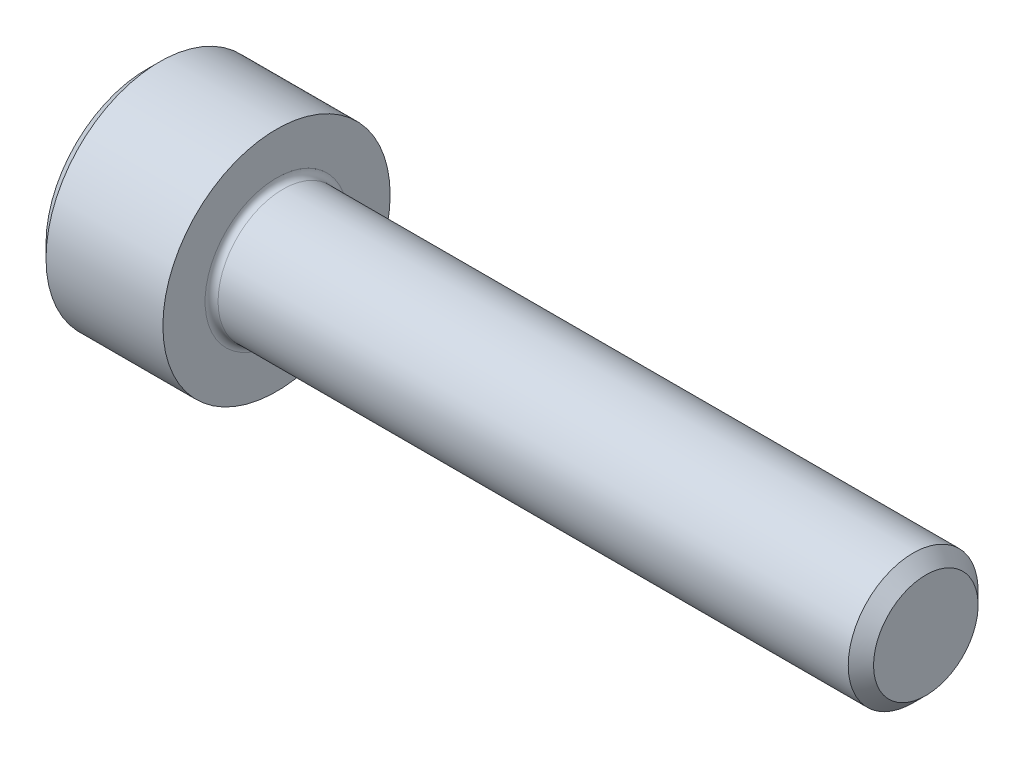
ISO-10303-21;
HEADER;
FILE_DESCRIPTION(('STEP AP214'),'2;1');
FILE_NAME('part.step','',(''),(''),'','','');
FILE_SCHEMA(('AUTOMOTIVE_DESIGN { 1 0 10303 214 1 1 1 1 }'));
ENDSEC;
DATA;
#1=APPLICATION_CONTEXT('core data for automotive mechanical design processes');
#2=APPLICATION_PROTOCOL_DEFINITION('international standard','automotive_design',2000,#1);
#3=PRODUCT_CONTEXT('',#1,'mechanical');
#4=PRODUCT('Part','Part','',(#3));
#5=PRODUCT_RELATED_PRODUCT_CATEGORY('part','',(#4));
#6=PRODUCT_DEFINITION_FORMATION('','',#4);
#7=PRODUCT_DEFINITION_CONTEXT('part definition',#1,'design');
#8=PRODUCT_DEFINITION('design','',#6,#7);
#9=PRODUCT_DEFINITION_SHAPE('','',#8);
#10=(LENGTH_UNIT() NAMED_UNIT(*) SI_UNIT(.MILLI.,.METRE.));
#11=(NAMED_UNIT(*) PLANE_ANGLE_UNIT() SI_UNIT($,.RADIAN.));
#12=(NAMED_UNIT(*) SI_UNIT($,.STERADIAN.) SOLID_ANGLE_UNIT());
#13=UNCERTAINTY_MEASURE_WITH_UNIT(LENGTH_MEASURE(1.E-05),#10,'distance_accuracy_value','');
#14=(GEOMETRIC_REPRESENTATION_CONTEXT(3) GLOBAL_UNCERTAINTY_ASSIGNED_CONTEXT((#13)) GLOBAL_UNIT_ASSIGNED_CONTEXT((#10,
#11,#12)) REPRESENTATION_CONTEXT('',''));
#15=CARTESIAN_POINT('',(0.,0.,0.));
#16=DIRECTION('',(0.,0.,1.));
#17=DIRECTION('',(1.,0.,0.));
#18=AXIS2_PLACEMENT_3D('',#15,#16,#17);
#19=CARTESIAN_POINT('',(0.,0.,0.));
#20=DIRECTION('',(-1.,0.,0.));
#21=DIRECTION('',(0.,0.,1.));
#22=AXIS2_PLACEMENT_3D('',#19,#20,#21);
#23=PLANE('',#22);
#24=DIRECTION('',(0.,-0.499999999999999,0.866025403784439));
#25=VECTOR('',#24,1.);
#26=CARTESIAN_POINT('',(0.,1.77304267668134,0.));
#27=LINE('',#26,#25);
#28=CARTESIAN_POINT('',(0.,1.77304267668134,0.));
#29=VERTEX_POINT('',#28);
#30=CARTESIAN_POINT('',(0.,0.886521338340669,1.5355));
#31=VERTEX_POINT('',#30);
#32=EDGE_CURVE('E260',#29,#31,#27,.T.);
#33=ORIENTED_EDGE('',*,*,#32,.T.);
#34=DIRECTION('',(0.,1.,0.));
#35=VECTOR('',#34,1.);
#36=CARTESIAN_POINT('',(0.,-0.886521338340672,1.5355));
#37=LINE('',#36,#35);
#38=CARTESIAN_POINT('',(0.,-0.886521338340672,1.5355));
#39=VERTEX_POINT('',#38);
#40=EDGE_CURVE('E131',#39,#31,#37,.T.);
#41=ORIENTED_EDGE('',*,*,#40,.F.);
#42=DIRECTION('',(0.,-0.500000000000001,-0.866025403784438));
#43=VECTOR('',#42,1.);
#44=CARTESIAN_POINT('',(0.,-0.886521338340672,1.5355));
#45=LINE('',#44,#43);
#46=CARTESIAN_POINT('',(0.,-1.77304267668134,0.));
#47=VERTEX_POINT('',#46);
#48=EDGE_CURVE('E263',#39,#47,#45,.T.);
#49=ORIENTED_EDGE('',*,*,#48,.T.);
#50=DIRECTION('',(0.,0.499999999999999,-0.866025403784439));
#51=VECTOR('',#50,1.);
#52=CARTESIAN_POINT('',(0.,-1.77304267668134,0.));
#53=LINE('',#52,#51);
#54=CARTESIAN_POINT('',(0.,-0.886521338340676,-1.5355));
#55=VERTEX_POINT('',#54);
#56=EDGE_CURVE('E266',#47,#55,#53,.T.);
#57=ORIENTED_EDGE('',*,*,#56,.T.);
#58=DIRECTION('',(0.,-1.,0.));
#59=VECTOR('',#58,1.);
#60=CARTESIAN_POINT('',(0.,0.886521338340665,-1.5355));
#61=LINE('',#60,#59);
#62=CARTESIAN_POINT('',(0.,0.886521338340665,-1.5355));
#63=VERTEX_POINT('',#62);
#64=EDGE_CURVE('E269',#63,#55,#61,.T.);
#65=ORIENTED_EDGE('',*,*,#64,.F.);
#66=DIRECTION('',(0.,-0.500000000000001,-0.866025403784438));
#67=VECTOR('',#66,1.);
#68=CARTESIAN_POINT('',(0.,1.77304267668134,0.));
#69=LINE('',#68,#67);
#70=EDGE_CURVE('E126',#29,#63,#69,.T.);
#71=ORIENTED_EDGE('',*,*,#70,.F.);
#72=EDGE_LOOP('',(#33,#41,#49,#57,#65,#71));
#73=FACE_BOUND('',#72,.T.);
#74=CARTESIAN_POINT('',(0.,0.,0.));
#75=DIRECTION('',(-1.,0.,0.));
#76=DIRECTION('',(0.,0.,1.));
#77=AXIS2_PLACEMENT_3D('',#74,#75,#76);
#78=CIRCLE('',#77,3.1);
#79=CARTESIAN_POINT('',(0.,0.,3.1));
#80=VERTEX_POINT('',#79);
#81=EDGE_CURVE('E155',#80,#80,#78,.T.);
#82=ORIENTED_EDGE('',*,*,#81,.T.);
#83=EDGE_LOOP('',(#82));
#84=FACE_BOUND('',#83,.T.);
#85=ADVANCED_FACE('F35',(#73,#84),#23,.T.);
#86=CARTESIAN_POINT('',(0.,0.,0.));
#87=DIRECTION('',(1.,0.,0.));
#88=DIRECTION('',(0.,0.,-1.));
#89=AXIS2_PLACEMENT_3D('',#86,#87,#88);
#90=CONICAL_SURFACE('',#89,3.1,0.785398163397451);
#91=CARTESIAN_POINT('',(0.399999999999998,0.,0.));
#92=DIRECTION('',(-1.,0.,0.));
#93=DIRECTION('',(0.,0.,1.));
#94=AXIS2_PLACEMENT_3D('',#91,#92,#93);
#95=CIRCLE('',#94,3.5);
#96=CARTESIAN_POINT('',(0.399999999999998,0.,3.5));
#97=VERTEX_POINT('',#96);
#98=EDGE_CURVE('E152',#97,#97,#95,.T.);
#99=ORIENTED_EDGE('',*,*,#98,.T.);
#100=EDGE_LOOP('',(#99));
#101=FACE_BOUND('',#100,.T.);
#102=ORIENTED_EDGE('',*,*,#81,.F.);
#103=EDGE_LOOP('',(#102));
#104=FACE_BOUND('',#103,.T.);
#105=ADVANCED_FACE('F176',(#101,#104),#90,.T.);
#106=CARTESIAN_POINT('',(-31.75,0.,0.));
#107=DIRECTION('',(-1.,0.,0.));
#108=DIRECTION('',(0.,0.,1.));
#109=AXIS2_PLACEMENT_3D('',#106,#107,#108);
#110=CYLINDRICAL_SURFACE('',#109,3.5);
#111=CARTESIAN_POINT('',(4.,0.,0.));
#112=DIRECTION('',(-1.,0.,0.));
#113=DIRECTION('',(0.,0.,1.));
#114=AXIS2_PLACEMENT_3D('',#111,#112,#113);
#115=CIRCLE('',#114,3.5);
#116=CARTESIAN_POINT('',(4.,0.,3.5));
#117=VERTEX_POINT('',#116);
#118=EDGE_CURVE('E149',#117,#117,#115,.T.);
#119=ORIENTED_EDGE('',*,*,#118,.T.);
#120=EDGE_LOOP('',(#119));
#121=FACE_BOUND('',#120,.T.);
#122=ORIENTED_EDGE('',*,*,#98,.F.);
#123=EDGE_LOOP('',(#122));
#124=FACE_BOUND('',#123,.T.);
#125=ADVANCED_FACE('F181',(#121,#124),#110,.T.);
#126=CARTESIAN_POINT('',(4.,3.5,0.));
#127=DIRECTION('',(1.,0.,0.));
#128=DIRECTION('',(0.,0.,-1.));
#129=AXIS2_PLACEMENT_3D('',#126,#127,#128);
#130=PLANE('',#129);
#131=CARTESIAN_POINT('',(4.,0.,0.));
#132=DIRECTION('',(1.,0.,0.));
#133=DIRECTION('',(0.,0.,-1.));
#134=AXIS2_PLACEMENT_3D('',#131,#132,#133);
#135=CIRCLE('',#134,2.19999999999999);
#136=CARTESIAN_POINT('',(4.,0.,-2.19999999999999));
#137=VERTEX_POINT('',#136);
#138=EDGE_CURVE('E43',#137,#137,#135,.F.);
#139=ORIENTED_EDGE('',*,*,#138,.T.);
#140=EDGE_LOOP('',(#139));
#141=FACE_BOUND('',#140,.T.);
#142=ORIENTED_EDGE('',*,*,#118,.F.);
#143=EDGE_LOOP('',(#142));
#144=FACE_BOUND('',#143,.T.);
#145=ADVANCED_FACE('F160',(#141,#144),#130,.T.);
#146=CARTESIAN_POINT('',(-31.75,0.,0.));
#147=DIRECTION('',(-1.,0.,0.));
#148=DIRECTION('',(0.,0.,1.));
#149=AXIS2_PLACEMENT_3D('',#146,#147,#148);
#150=CYLINDRICAL_SURFACE('',#149,1.99999999999999);
#151=CARTESIAN_POINT('',(4.2,0.,0.));
#152=DIRECTION('',(1.,0.,0.));
#153=DIRECTION('',(0.,0.,-1.));
#154=AXIS2_PLACEMENT_3D('',#151,#152,#153);
#155=CIRCLE('',#154,1.99999999999999);
#156=CARTESIAN_POINT('',(4.2,0.,-1.99999999999999));
#157=VERTEX_POINT('',#156);
#158=EDGE_CURVE('E11',#157,#157,#155,.T.);
#159=ORIENTED_EDGE('',*,*,#158,.T.);
#160=EDGE_LOOP('',(#159));
#161=FACE_BOUND('',#160,.T.);
#162=CARTESIAN_POINT('',(23.61,0.,0.));
#163=DIRECTION('',(-1.,0.,0.));
#164=DIRECTION('',(0.,0.,1.));
#165=AXIS2_PLACEMENT_3D('',#162,#163,#164);
#166=CIRCLE('',#165,1.99999999999997);
#167=CARTESIAN_POINT('',(23.61,0.,1.99999999999997));
#168=VERTEX_POINT('',#167);
#169=EDGE_CURVE('E146',#168,#168,#166,.T.);
#170=ORIENTED_EDGE('',*,*,#169,.T.);
#171=EDGE_LOOP('',(#170));
#172=FACE_BOUND('',#171,.T.);
#173=ADVANCED_FACE('F191',(#161,#172),#150,.T.);
#174=CARTESIAN_POINT('',(24.,0.,0.));
#175=DIRECTION('',(-1.,0.,0.));
#176=DIRECTION('',(0.,0.,1.));
#177=AXIS2_PLACEMENT_3D('',#174,#175,#176);
#178=CONICAL_SURFACE('',#177,1.61,0.785398163397392);
#179=ORIENTED_EDGE('',*,*,#169,.F.);
#180=EDGE_LOOP('',(#179));
#181=FACE_BOUND('',#180,.T.);
#182=CARTESIAN_POINT('',(24.,0.,0.));
#183=DIRECTION('',(-1.,0.,0.));
#184=DIRECTION('',(0.,0.,1.));
#185=AXIS2_PLACEMENT_3D('',#182,#183,#184);
#186=CIRCLE('',#185,1.61);
#187=CARTESIAN_POINT('',(24.,0.,1.61));
#188=VERTEX_POINT('',#187);
#189=EDGE_CURVE('E142',#188,#188,#186,.T.);
#190=ORIENTED_EDGE('',*,*,#189,.T.);
#191=EDGE_LOOP('',(#190));
#192=FACE_BOUND('',#191,.T.);
#193=ADVANCED_FACE('F171',(#181,#192),#178,.T.);
#194=CARTESIAN_POINT('',(24.,1.61,0.));
#195=DIRECTION('',(1.,0.,0.));
#196=DIRECTION('',(0.,0.,-1.));
#197=AXIS2_PLACEMENT_3D('',#194,#195,#196);
#198=PLANE('',#197);
#199=ORIENTED_EDGE('',*,*,#189,.F.);
#200=EDGE_LOOP('',(#199));
#201=FACE_BOUND('',#200,.T.);
#202=ADVANCED_FACE('F164',(#201),#198,.T.);
#203=CARTESIAN_POINT('',(4.2,0.,0.));
#204=DIRECTION('',(1.,0.,0.));
#205=DIRECTION('',(0.,0.,-1.));
#206=AXIS2_PLACEMENT_3D('',#203,#204,#205);
#207=TOROIDAL_SURFACE('',#206,2.19999999999999,0.2);
#208=ORIENTED_EDGE('',*,*,#158,.F.);
#209=EDGE_LOOP('',(#208));
#210=FACE_BOUND('',#209,.T.);
#211=ORIENTED_EDGE('',*,*,#138,.F.);
#212=EDGE_LOOP('',(#211));
#213=FACE_BOUND('',#212,.T.);
#214=ADVANCED_FACE('F37',(#210,#213),#207,.F.);
#215=CARTESIAN_POINT('',(2.,1.77304267668134,0.));
#216=DIRECTION('',(0.,-0.866025403784439,-0.499999999999999));
#217=DIRECTION('',(0.,0.499999999999999,-0.866025403784439));
#218=AXIS2_PLACEMENT_3D('',#215,#216,#217);
#219=PLANE('',#218);
#220=ORIENTED_EDGE('',*,*,#32,.F.);
#221=DIRECTION('',(-1.,0.,0.));
#222=VECTOR('',#221,1.);
#223=CARTESIAN_POINT('',(2.,1.77304267668134,0.));
#224=LINE('',#223,#222);
#225=CARTESIAN_POINT('',(2.,1.77304267668134,0.));
#226=VERTEX_POINT('',#225);
#227=EDGE_CURVE('E250',#226,#29,#224,.T.);
#228=ORIENTED_EDGE('',*,*,#227,.F.);
#229=DIRECTION('',(0.,-0.499999999999999,0.866025403784439));
#230=VECTOR('',#229,1.);
#231=CARTESIAN_POINT('',(2.,1.77304267668134,0.));
#232=LINE('',#231,#230);
#233=CARTESIAN_POINT('',(2.,1.329782007511,0.767749999999997));
#234=VERTEX_POINT('',#233);
#235=EDGE_CURVE('E118',#226,#234,#232,.T.);
#236=ORIENTED_EDGE('',*,*,#235,.T.);
#237=CARTESIAN_POINT('',(2.,0.886521338340669,1.5355));
#238=VERTEX_POINT('',#237);
#239=EDGE_CURVE('E109',#234,#238,#232,.T.);
#240=ORIENTED_EDGE('',*,*,#239,.T.);
#241=DIRECTION('',(-1.,0.,0.));
#242=VECTOR('',#241,1.);
#243=CARTESIAN_POINT('',(2.,0.886521338340669,1.5355));
#244=LINE('',#243,#242);
#245=EDGE_CURVE('E123',#238,#31,#244,.T.);
#246=ORIENTED_EDGE('',*,*,#245,.T.);
#247=EDGE_LOOP('',(#220,#228,#236,#240,#246));
#248=FACE_BOUND('',#247,.T.);
#249=ADVANCED_FACE('F122',(#248),#219,.T.);
#250=CARTESIAN_POINT('',(2.,-0.886521338340672,1.5355));
#251=DIRECTION('',(0.,0.,1.));
#252=DIRECTION('',(0.,-1.,0.));
#253=AXIS2_PLACEMENT_3D('',#250,#251,#252);
#254=PLANE('',#253);
#255=ORIENTED_EDGE('',*,*,#40,.T.);
#256=ORIENTED_EDGE('',*,*,#245,.F.);
#257=DIRECTION('',(0.,1.,0.));
#258=VECTOR('',#257,1.);
#259=CARTESIAN_POINT('',(2.,-0.886521338340672,1.5355));
#260=LINE('',#259,#258);
#261=CARTESIAN_POINT('',(2.,0.,1.5355));
#262=VERTEX_POINT('',#261);
#263=EDGE_CURVE('E106',#262,#238,#260,.T.);
#264=ORIENTED_EDGE('',*,*,#263,.F.);
#265=CARTESIAN_POINT('',(2.,-0.886521338340672,1.5355));
#266=VERTEX_POINT('',#265);
#267=EDGE_CURVE('E117',#266,#262,#260,.T.);
#268=ORIENTED_EDGE('',*,*,#267,.F.);
#269=DIRECTION('',(-1.,0.,0.));
#270=VECTOR('',#269,1.);
#271=CARTESIAN_POINT('',(2.,-0.886521338340672,1.5355));
#272=LINE('',#271,#270);
#273=EDGE_CURVE('E133',#266,#39,#272,.T.);
#274=ORIENTED_EDGE('',*,*,#273,.T.);
#275=EDGE_LOOP('',(#255,#256,#264,#268,#274));
#276=FACE_BOUND('',#275,.T.);
#277=ADVANCED_FACE('F128',(#276),#254,.F.);
#278=CARTESIAN_POINT('',(2.,-0.886521338340672,1.5355));
#279=DIRECTION('',(0.,0.866025403784438,-0.500000000000001));
#280=DIRECTION('',(0.,0.500000000000001,0.866025403784438));
#281=AXIS2_PLACEMENT_3D('',#278,#279,#280);
#282=PLANE('',#281);
#283=ORIENTED_EDGE('',*,*,#48,.F.);
#284=ORIENTED_EDGE('',*,*,#273,.F.);
#285=DIRECTION('',(0.,-0.500000000000001,-0.866025403784438));
#286=VECTOR('',#285,1.);
#287=CARTESIAN_POINT('',(2.,-0.886521338340672,1.5355));
#288=LINE('',#287,#286);
#289=CARTESIAN_POINT('',(2.,-1.32978200751101,0.767750000000002));
#290=VERTEX_POINT('',#289);
#291=EDGE_CURVE('E289',#266,#290,#288,.T.);
#292=ORIENTED_EDGE('',*,*,#291,.T.);
#293=CARTESIAN_POINT('',(2.,-1.77304267668134,0.));
#294=VERTEX_POINT('',#293);
#295=EDGE_CURVE('E278',#290,#294,#288,.T.);
#296=ORIENTED_EDGE('',*,*,#295,.T.);
#297=DIRECTION('',(-1.,0.,0.));
#298=VECTOR('',#297,1.);
#299=CARTESIAN_POINT('',(2.,-1.77304267668134,0.));
#300=LINE('',#299,#298);
#301=EDGE_CURVE('E138',#294,#47,#300,.T.);
#302=ORIENTED_EDGE('',*,*,#301,.T.);
#303=EDGE_LOOP('',(#283,#284,#292,#296,#302));
#304=FACE_BOUND('',#303,.T.);
#305=ADVANCED_FACE('F204',(#304),#282,.T.);
#306=CARTESIAN_POINT('',(2.,-1.77304267668134,0.));
#307=DIRECTION('',(0.,0.866025403784439,0.499999999999999));
#308=DIRECTION('',(0.,-0.499999999999999,0.866025403784439));
#309=AXIS2_PLACEMENT_3D('',#306,#307,#308);
#310=PLANE('',#309);
#311=ORIENTED_EDGE('',*,*,#56,.F.);
#312=ORIENTED_EDGE('',*,*,#301,.F.);
#313=DIRECTION('',(0.,0.499999999999999,-0.866025403784439));
#314=VECTOR('',#313,1.);
#315=CARTESIAN_POINT('',(2.,-1.77304267668134,0.));
#316=LINE('',#315,#314);
#317=CARTESIAN_POINT('',(2.,-1.32978200751101,-0.76775));
#318=VERTEX_POINT('',#317);
#319=EDGE_CURVE('E256',#294,#318,#316,.T.);
#320=ORIENTED_EDGE('',*,*,#319,.T.);
#321=CARTESIAN_POINT('',(2.,-0.886521338340676,-1.5355));
#322=VERTEX_POINT('',#321);
#323=EDGE_CURVE('E288',#318,#322,#316,.T.);
#324=ORIENTED_EDGE('',*,*,#323,.T.);
#325=DIRECTION('',(-1.,0.,0.));
#326=VECTOR('',#325,1.);
#327=CARTESIAN_POINT('',(2.,-0.886521338340676,-1.5355));
#328=LINE('',#327,#326);
#329=EDGE_CURVE('E249',#322,#55,#328,.T.);
#330=ORIENTED_EDGE('',*,*,#329,.T.);
#331=EDGE_LOOP('',(#311,#312,#320,#324,#330));
#332=FACE_BOUND('',#331,.T.);
#333=ADVANCED_FACE('F207',(#332),#310,.T.);
#334=CARTESIAN_POINT('',(2.,0.886521338340665,-1.5355));
#335=DIRECTION('',(0.,0.,-1.));
#336=DIRECTION('',(0.,1.,0.));
#337=AXIS2_PLACEMENT_3D('',#334,#335,#336);
#338=PLANE('',#337);
#339=ORIENTED_EDGE('',*,*,#64,.T.);
#340=ORIENTED_EDGE('',*,*,#329,.F.);
#341=DIRECTION('',(0.,-1.,0.));
#342=VECTOR('',#341,1.);
#343=CARTESIAN_POINT('',(2.,0.886521338340665,-1.5355));
#344=LINE('',#343,#342);
#345=CARTESIAN_POINT('',(2.,0.,-1.5355));
#346=VERTEX_POINT('',#345);
#347=EDGE_CURVE('E253',#346,#322,#344,.T.);
#348=ORIENTED_EDGE('',*,*,#347,.F.);
#349=CARTESIAN_POINT('',(2.,0.886521338340665,-1.5355));
#350=VERTEX_POINT('',#349);
#351=EDGE_CURVE('E50',#350,#346,#344,.T.);
#352=ORIENTED_EDGE('',*,*,#351,.F.);
#353=DIRECTION('',(-1.,0.,0.));
#354=VECTOR('',#353,1.);
#355=CARTESIAN_POINT('',(2.,0.886521338340665,-1.5355));
#356=LINE('',#355,#354);
#357=EDGE_CURVE('E246',#350,#63,#356,.T.);
#358=ORIENTED_EDGE('',*,*,#357,.T.);
#359=EDGE_LOOP('',(#339,#340,#348,#352,#358));
#360=FACE_BOUND('',#359,.T.);
#361=ADVANCED_FACE('F211',(#360),#338,.F.);
#362=CARTESIAN_POINT('',(2.,1.77304267668134,0.));
#363=DIRECTION('',(0.,0.866025403784438,-0.500000000000001));
#364=DIRECTION('',(0.,0.500000000000001,0.866025403784438));
#365=AXIS2_PLACEMENT_3D('',#362,#363,#364);
#366=PLANE('',#365);
#367=ORIENTED_EDGE('',*,*,#70,.T.);
#368=ORIENTED_EDGE('',*,*,#357,.F.);
#369=DIRECTION('',(0.,-0.500000000000001,-0.866025403784438));
#370=VECTOR('',#369,1.);
#371=CARTESIAN_POINT('',(2.,1.77304267668134,0.));
#372=LINE('',#371,#370);
#373=CARTESIAN_POINT('',(2.,1.329782007511,-0.767750000000001));
#374=VERTEX_POINT('',#373);
#375=EDGE_CURVE('E236',#374,#350,#372,.T.);
#376=ORIENTED_EDGE('',*,*,#375,.F.);
#377=EDGE_CURVE('E242',#226,#374,#372,.T.);
#378=ORIENTED_EDGE('',*,*,#377,.F.);
#379=ORIENTED_EDGE('',*,*,#227,.T.);
#380=EDGE_LOOP('',(#367,#368,#376,#378,#379));
#381=FACE_BOUND('',#380,.T.);
#382=ADVANCED_FACE('F215',(#381),#366,.F.);
#383=CARTESIAN_POINT('',(2.,1.77304267668134,0.));
#384=DIRECTION('',(1.,0.,0.));
#385=DIRECTION('',(0.,0.,-1.));
#386=AXIS2_PLACEMENT_3D('',#383,#384,#385);
#387=PLANE('',#386);
#388=ORIENTED_EDGE('',*,*,#347,.T.);
#389=ORIENTED_EDGE('',*,*,#323,.F.);
#390=CARTESIAN_POINT('',(2.,0.,0.));
#391=DIRECTION('',(-1.,0.,0.));
#392=DIRECTION('',(0.,0.,1.));
#393=AXIS2_PLACEMENT_3D('',#390,#391,#392);
#394=CIRCLE('',#393,1.5355);
#395=EDGE_CURVE('E284',#346,#318,#394,.T.);
#396=ORIENTED_EDGE('',*,*,#395,.F.);
#397=EDGE_LOOP('',(#388,#389,#396));
#398=FACE_BOUND('',#397,.T.);
#399=ADVANCED_FACE('F219',(#398),#387,.F.);
#400=ORIENTED_EDGE('',*,*,#319,.F.);
#401=ORIENTED_EDGE('',*,*,#295,.F.);
#402=EDGE_CURVE('E136',#318,#290,#394,.T.);
#403=ORIENTED_EDGE('',*,*,#402,.F.);
#404=EDGE_LOOP('',(#400,#401,#403));
#405=FACE_BOUND('',#404,.T.);
#406=ADVANCED_FACE('F222',(#405),#387,.F.);
#407=ORIENTED_EDGE('',*,*,#291,.F.);
#408=ORIENTED_EDGE('',*,*,#267,.T.);
#409=EDGE_CURVE('E132',#290,#262,#394,.T.);
#410=ORIENTED_EDGE('',*,*,#409,.F.);
#411=EDGE_LOOP('',(#407,#408,#410));
#412=FACE_BOUND('',#411,.T.);
#413=ADVANCED_FACE('F227',(#412),#387,.F.);
#414=ORIENTED_EDGE('',*,*,#263,.T.);
#415=ORIENTED_EDGE('',*,*,#239,.F.);
#416=EDGE_CURVE('E112',#262,#234,#394,.T.);
#417=ORIENTED_EDGE('',*,*,#416,.F.);
#418=EDGE_LOOP('',(#414,#415,#417));
#419=FACE_BOUND('',#418,.T.);
#420=ADVANCED_FACE('F108',(#419),#387,.F.);
#421=ORIENTED_EDGE('',*,*,#235,.F.);
#422=ORIENTED_EDGE('',*,*,#377,.T.);
#423=EDGE_CURVE('E143',#234,#374,#394,.T.);
#424=ORIENTED_EDGE('',*,*,#423,.F.);
#425=EDGE_LOOP('',(#421,#422,#424));
#426=FACE_BOUND('',#425,.T.);
#427=ADVANCED_FACE('F230',(#426),#387,.F.);
#428=ORIENTED_EDGE('',*,*,#375,.T.);
#429=ORIENTED_EDGE('',*,*,#351,.T.);
#430=EDGE_CURVE('E239',#374,#346,#394,.T.);
#431=ORIENTED_EDGE('',*,*,#430,.F.);
#432=EDGE_LOOP('',(#428,#429,#431));
#433=FACE_BOUND('',#432,.T.);
#434=ADVANCED_FACE('F200',(#433),#387,.F.);
#435=CARTESIAN_POINT('',(2.,0.,0.));
#436=DIRECTION('',(-1.,0.,0.));
#437=DIRECTION('',(0.,0.,1.));
#438=AXIS2_PLACEMENT_3D('',#435,#436,#437);
#439=CONICAL_SURFACE('',#438,1.5355,1.04719755119659);
#440=CARTESIAN_POINT('',(2.88652133834068,0.,0.));
#441=VERTEX_POINT('',#440);
#442=VERTEX_LOOP('',#441);
#443=FACE_BOUND('',#442,.T.);
#444=ORIENTED_EDGE('',*,*,#416,.T.);
#445=ORIENTED_EDGE('',*,*,#423,.T.);
#446=ORIENTED_EDGE('',*,*,#430,.T.);
#447=ORIENTED_EDGE('',*,*,#395,.T.);
#448=ORIENTED_EDGE('',*,*,#402,.T.);
#449=ORIENTED_EDGE('',*,*,#409,.T.);
#450=EDGE_LOOP('',(#444,#445,#446,#447,#448,#449));
#451=FACE_BOUND('',#450,.T.);
#452=ADVANCED_FACE('F198',(#443,#451),#439,.F.);
#453=CLOSED_SHELL('',(#85,#105,#125,#145,#173,#193,#202,#214,#249,#277,#305,#333,#361,#382,#399,
#406,#413,#420,#427,#434,#452));
#454=MANIFOLD_SOLID_BREP('B2',#453);
#455=ADVANCED_BREP_SHAPE_REPRESENTATION('',(#18,#454),#14);
#456=SHAPE_DEFINITION_REPRESENTATION(#9,#455);
ENDSEC;
END-ISO-10303-21;
